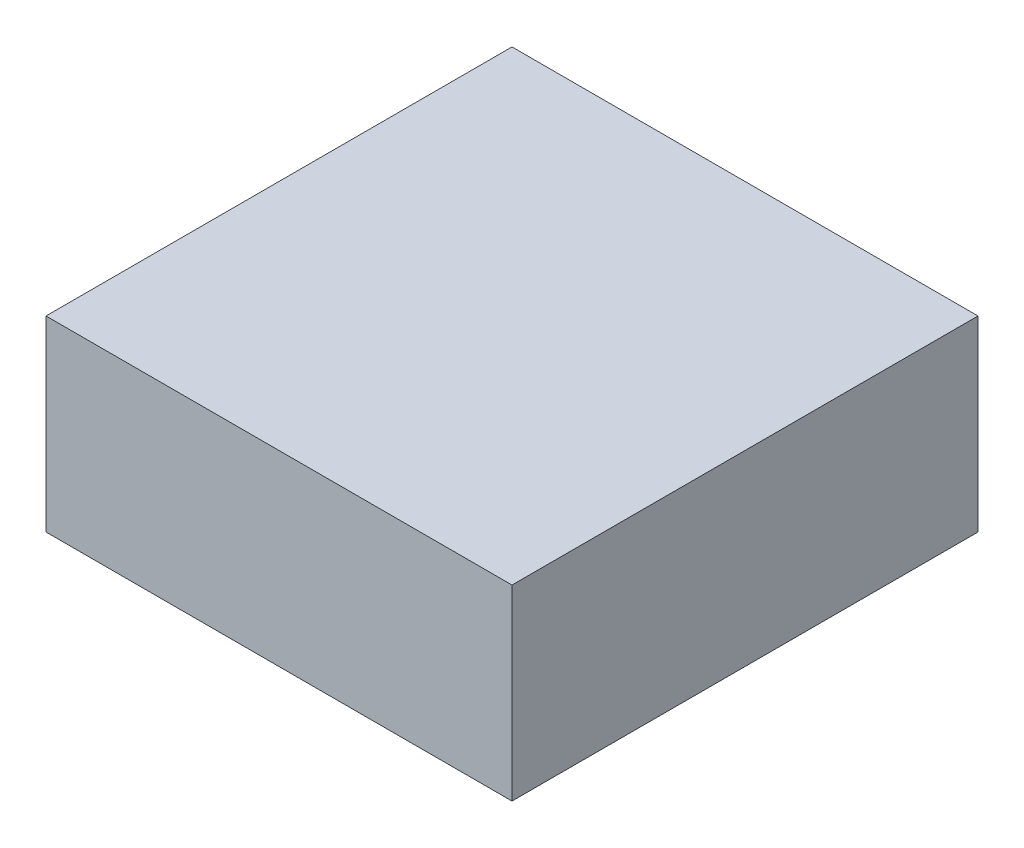
ISO-10303-21;
HEADER;
FILE_DESCRIPTION(('STEP AP214'),'2;1');
FILE_NAME('part.step','',(''),(''),'','','');
FILE_SCHEMA(('AUTOMOTIVE_DESIGN { 1 0 10303 214 1 1 1 1 }'));
ENDSEC;
DATA;
#1=APPLICATION_CONTEXT('core data for automotive mechanical design processes');
#2=APPLICATION_PROTOCOL_DEFINITION('international standard','automotive_design',2000,#1);
#3=PRODUCT_CONTEXT('',#1,'mechanical');
#4=PRODUCT('Part','Part','',(#3));
#5=PRODUCT_RELATED_PRODUCT_CATEGORY('part','',(#4));
#6=PRODUCT_DEFINITION_FORMATION('','',#4);
#7=PRODUCT_DEFINITION_CONTEXT('part definition',#1,'design');
#8=PRODUCT_DEFINITION('design','',#6,#7);
#9=PRODUCT_DEFINITION_SHAPE('','',#8);
#10=(LENGTH_UNIT() NAMED_UNIT(*) SI_UNIT(.MILLI.,.METRE.));
#11=(NAMED_UNIT(*) PLANE_ANGLE_UNIT() SI_UNIT($,.RADIAN.));
#12=(NAMED_UNIT(*) SI_UNIT($,.STERADIAN.) SOLID_ANGLE_UNIT());
#13=UNCERTAINTY_MEASURE_WITH_UNIT(LENGTH_MEASURE(1.E-05),#10,'distance_accuracy_value','');
#14=(GEOMETRIC_REPRESENTATION_CONTEXT(3) GLOBAL_UNCERTAINTY_ASSIGNED_CONTEXT((#13)) GLOBAL_UNIT_ASSIGNED_CONTEXT((#10,
#11,#12)) REPRESENTATION_CONTEXT('',''));
#15=CARTESIAN_POINT('',(0.,0.,0.));
#16=DIRECTION('',(0.,0.,1.));
#17=DIRECTION('',(1.,0.,0.));
#18=AXIS2_PLACEMENT_3D('',#15,#16,#17);
#19=CARTESIAN_POINT('',(3.91,-3.14,-3.91));
#20=DIRECTION('',(1.,0.,0.));
#21=DIRECTION('',(0.,0.,-1.));
#22=AXIS2_PLACEMENT_3D('',#19,#20,#21);
#23=PLANE('',#22);
#24=DIRECTION('',(0.,0.,-1.));
#25=VECTOR('',#24,1.);
#26=CARTESIAN_POINT('',(3.91,0.,-3.91));
#27=LINE('',#26,#25);
#28=CARTESIAN_POINT('',(3.91,0.,3.91));
#29=VERTEX_POINT('',#28);
#30=CARTESIAN_POINT('',(3.91,0.,-3.91));
#31=VERTEX_POINT('',#30);
#32=EDGE_CURVE('E114',#29,#31,#27,.T.);
#33=ORIENTED_EDGE('',*,*,#32,.F.);
#34=DIRECTION('',(0.,1.,0.));
#35=VECTOR('',#34,1.);
#36=CARTESIAN_POINT('',(3.91,-3.14,3.91));
#37=LINE('',#36,#35);
#38=CARTESIAN_POINT('',(3.91,-3.14,3.91));
#39=VERTEX_POINT('',#38);
#40=EDGE_CURVE('E11',#39,#29,#37,.T.);
#41=ORIENTED_EDGE('',*,*,#40,.F.);
#42=DIRECTION('',(0.,0.,-1.));
#43=VECTOR('',#42,1.);
#44=CARTESIAN_POINT('',(3.91,-3.14,-3.91));
#45=LINE('',#44,#43);
#46=CARTESIAN_POINT('',(3.91,-3.14,-3.91));
#47=VERTEX_POINT('',#46);
#48=EDGE_CURVE('E145',#39,#47,#45,.T.);
#49=ORIENTED_EDGE('',*,*,#48,.T.);
#50=DIRECTION('',(0.,1.,0.));
#51=VECTOR('',#50,1.);
#52=CARTESIAN_POINT('',(3.91,-3.14,-3.91));
#53=LINE('',#52,#51);
#54=EDGE_CURVE('E35',#47,#31,#53,.T.);
#55=ORIENTED_EDGE('',*,*,#54,.T.);
#56=EDGE_LOOP('',(#33,#41,#49,#55));
#57=FACE_BOUND('',#56,.T.);
#58=ADVANCED_FACE('F32',(#57),#23,.T.);
#59=CARTESIAN_POINT('',(-3.91,-3.14,3.91));
#60=DIRECTION('',(0.,0.,1.));
#61=DIRECTION('',(1.,0.,0.));
#62=AXIS2_PLACEMENT_3D('',#59,#60,#61);
#63=PLANE('',#62);
#64=DIRECTION('',(1.,0.,0.));
#65=VECTOR('',#64,1.);
#66=CARTESIAN_POINT('',(-3.91,0.,3.91));
#67=LINE('',#66,#65);
#68=CARTESIAN_POINT('',(-3.91,0.,3.91));
#69=VERTEX_POINT('',#68);
#70=EDGE_CURVE('E148',#69,#29,#67,.T.);
#71=ORIENTED_EDGE('',*,*,#70,.F.);
#72=DIRECTION('',(0.,1.,0.));
#73=VECTOR('',#72,1.);
#74=CARTESIAN_POINT('',(-3.91,-3.14,3.91));
#75=LINE('',#74,#73);
#76=CARTESIAN_POINT('',(-3.91,-3.14,3.91));
#77=VERTEX_POINT('',#76);
#78=EDGE_CURVE('E40',#77,#69,#75,.T.);
#79=ORIENTED_EDGE('',*,*,#78,.F.);
#80=DIRECTION('',(1.,0.,0.));
#81=VECTOR('',#80,1.);
#82=CARTESIAN_POINT('',(-3.91,-3.14,3.91));
#83=LINE('',#82,#81);
#84=EDGE_CURVE('E153',#77,#39,#83,.T.);
#85=ORIENTED_EDGE('',*,*,#84,.T.);
#86=ORIENTED_EDGE('',*,*,#40,.T.);
#87=EDGE_LOOP('',(#71,#79,#85,#86));
#88=FACE_BOUND('',#87,.T.);
#89=ADVANCED_FACE('F170',(#88),#63,.T.);
#90=CARTESIAN_POINT('',(-3.91,-3.14,-3.91));
#91=DIRECTION('',(-1.,0.,0.));
#92=DIRECTION('',(0.,0.,1.));
#93=AXIS2_PLACEMENT_3D('',#90,#91,#92);
#94=PLANE('',#93);
#95=DIRECTION('',(0.,0.,1.));
#96=VECTOR('',#95,1.);
#97=CARTESIAN_POINT('',(-3.91,0.,-3.91));
#98=LINE('',#97,#96);
#99=CARTESIAN_POINT('',(-3.91,0.,-3.91));
#100=VERTEX_POINT('',#99);
#101=EDGE_CURVE('E160',#100,#69,#98,.T.);
#102=ORIENTED_EDGE('',*,*,#101,.F.);
#103=DIRECTION('',(0.,1.,0.));
#104=VECTOR('',#103,1.);
#105=CARTESIAN_POINT('',(-3.91,-3.14,-3.91));
#106=LINE('',#105,#104);
#107=CARTESIAN_POINT('',(-3.91,-3.14,-3.91));
#108=VERTEX_POINT('',#107);
#109=EDGE_CURVE('E165',#108,#100,#106,.T.);
#110=ORIENTED_EDGE('',*,*,#109,.F.);
#111=DIRECTION('',(0.,0.,1.));
#112=VECTOR('',#111,1.);
#113=CARTESIAN_POINT('',(-3.91,-3.14,-3.91));
#114=LINE('',#113,#112);
#115=EDGE_CURVE('E150',#108,#77,#114,.T.);
#116=ORIENTED_EDGE('',*,*,#115,.T.);
#117=ORIENTED_EDGE('',*,*,#78,.T.);
#118=EDGE_LOOP('',(#102,#110,#116,#117));
#119=FACE_BOUND('',#118,.T.);
#120=ADVANCED_FACE('F174',(#119),#94,.T.);
#121=CARTESIAN_POINT('',(-3.91,-3.14,-3.91));
#122=DIRECTION('',(0.,0.,-1.));
#123=DIRECTION('',(-1.,0.,0.));
#124=AXIS2_PLACEMENT_3D('',#121,#122,#123);
#125=PLANE('',#124);
#126=DIRECTION('',(-1.,0.,0.));
#127=VECTOR('',#126,1.);
#128=CARTESIAN_POINT('',(-3.91,0.,-3.91));
#129=LINE('',#128,#127);
#130=EDGE_CURVE('E157',#31,#100,#129,.T.);
#131=ORIENTED_EDGE('',*,*,#130,.F.);
#132=ORIENTED_EDGE('',*,*,#54,.F.);
#133=DIRECTION('',(-1.,0.,0.));
#134=VECTOR('',#133,1.);
#135=CARTESIAN_POINT('',(-3.91,-3.14,-3.91));
#136=LINE('',#135,#134);
#137=EDGE_CURVE('E147',#47,#108,#136,.T.);
#138=ORIENTED_EDGE('',*,*,#137,.T.);
#139=ORIENTED_EDGE('',*,*,#109,.T.);
#140=EDGE_LOOP('',(#131,#132,#138,#139));
#141=FACE_BOUND('',#140,.T.);
#142=ADVANCED_FACE('F167',(#141),#125,.T.);
#143=CARTESIAN_POINT('',(0.,-3.14,0.));
#144=DIRECTION('',(0.,1.,0.));
#145=DIRECTION('',(0.,0.,1.));
#146=AXIS2_PLACEMENT_3D('',#143,#144,#145);
#147=PLANE('',#146);
#148=DIRECTION('',(1.,0.,0.));
#149=VECTOR('',#148,1.);
#150=CARTESIAN_POINT('',(0.,-3.14,2.41));
#151=LINE('',#150,#149);
#152=CARTESIAN_POINT('',(-2.41,-3.14,2.41));
#153=VERTEX_POINT('',#152);
#154=CARTESIAN_POINT('',(2.41,-3.14,2.41));
#155=VERTEX_POINT('',#154);
#156=EDGE_CURVE('E140',#153,#155,#151,.T.);
#157=ORIENTED_EDGE('',*,*,#156,.T.);
#158=DIRECTION('',(0.,0.,-1.));
#159=VECTOR('',#158,1.);
#160=CARTESIAN_POINT('',(2.41,-3.14,0.));
#161=LINE('',#160,#159);
#162=CARTESIAN_POINT('',(2.41,-3.14,-2.41));
#163=VERTEX_POINT('',#162);
#164=EDGE_CURVE('E109',#155,#163,#161,.T.);
#165=ORIENTED_EDGE('',*,*,#164,.T.);
#166=DIRECTION('',(-1.,0.,0.));
#167=VECTOR('',#166,1.);
#168=CARTESIAN_POINT('',(0.,-3.14,-2.41));
#169=LINE('',#168,#167);
#170=CARTESIAN_POINT('',(-2.41,-3.14,-2.41));
#171=VERTEX_POINT('',#170);
#172=EDGE_CURVE('E130',#163,#171,#169,.T.);
#173=ORIENTED_EDGE('',*,*,#172,.T.);
#174=DIRECTION('',(0.,0.,1.));
#175=VECTOR('',#174,1.);
#176=CARTESIAN_POINT('',(-2.41,-3.14,0.));
#177=LINE('',#176,#175);
#178=EDGE_CURVE('E48',#171,#153,#177,.T.);
#179=ORIENTED_EDGE('',*,*,#178,.T.);
#180=EDGE_LOOP('',(#157,#165,#173,#179));
#181=FACE_BOUND('',#180,.T.);
#182=ORIENTED_EDGE('',*,*,#48,.F.);
#183=ORIENTED_EDGE('',*,*,#84,.F.);
#184=ORIENTED_EDGE('',*,*,#115,.F.);
#185=ORIENTED_EDGE('',*,*,#137,.F.);
#186=EDGE_LOOP('',(#182,#183,#184,#185));
#187=FACE_BOUND('',#186,.T.);
#188=ADVANCED_FACE('F176',(#181,#187),#147,.F.);
#189=CARTESIAN_POINT('',(0.,0.,0.));
#190=DIRECTION('',(0.,1.,0.));
#191=DIRECTION('',(0.,0.,1.));
#192=AXIS2_PLACEMENT_3D('',#189,#190,#191);
#193=PLANE('',#192);
#194=ORIENTED_EDGE('',*,*,#32,.T.);
#195=ORIENTED_EDGE('',*,*,#130,.T.);
#196=ORIENTED_EDGE('',*,*,#101,.T.);
#197=ORIENTED_EDGE('',*,*,#70,.T.);
#198=EDGE_LOOP('',(#194,#195,#196,#197));
#199=FACE_BOUND('',#198,.T.);
#200=ADVANCED_FACE('F169',(#199),#193,.T.);
#201=CARTESIAN_POINT('',(2.41,-3.14,-3.91));
#202=DIRECTION('',(1.,0.,0.));
#203=DIRECTION('',(0.,0.,-1.));
#204=AXIS2_PLACEMENT_3D('',#201,#202,#203);
#205=PLANE('',#204);
#206=DIRECTION('',(0.,0.,-1.));
#207=VECTOR('',#206,1.);
#208=CARTESIAN_POINT('',(2.41,-1.5,0.));
#209=LINE('',#208,#207);
#210=CARTESIAN_POINT('',(2.41,-1.5,2.41));
#211=VERTEX_POINT('',#210);
#212=CARTESIAN_POINT('',(2.41,-1.5,-2.41));
#213=VERTEX_POINT('',#212);
#214=EDGE_CURVE('E107',#211,#213,#209,.T.);
#215=ORIENTED_EDGE('',*,*,#214,.T.);
#216=DIRECTION('',(0.,1.,0.));
#217=VECTOR('',#216,1.);
#218=CARTESIAN_POINT('',(2.41,-3.14,-2.41));
#219=LINE('',#218,#217);
#220=EDGE_CURVE('E135',#163,#213,#219,.T.);
#221=ORIENTED_EDGE('',*,*,#220,.F.);
#222=ORIENTED_EDGE('',*,*,#164,.F.);
#223=DIRECTION('',(0.,1.,0.));
#224=VECTOR('',#223,1.);
#225=CARTESIAN_POINT('',(2.41,-3.14,2.41));
#226=LINE('',#225,#224);
#227=EDGE_CURVE('E104',#155,#211,#226,.T.);
#228=ORIENTED_EDGE('',*,*,#227,.T.);
#229=EDGE_LOOP('',(#215,#221,#222,#228));
#230=FACE_BOUND('',#229,.T.);
#231=ADVANCED_FACE('F106',(#230),#205,.F.);
#232=CARTESIAN_POINT('',(-3.91,-3.14,2.41));
#233=DIRECTION('',(0.,0.,1.));
#234=DIRECTION('',(1.,0.,0.));
#235=AXIS2_PLACEMENT_3D('',#232,#233,#234);
#236=PLANE('',#235);
#237=DIRECTION('',(1.,0.,0.));
#238=VECTOR('',#237,1.);
#239=CARTESIAN_POINT('',(0.,-1.5,2.41));
#240=LINE('',#239,#238);
#241=CARTESIAN_POINT('',(-2.41,-1.5,2.41));
#242=VERTEX_POINT('',#241);
#243=EDGE_CURVE('E122',#242,#211,#240,.T.);
#244=ORIENTED_EDGE('',*,*,#243,.T.);
#245=ORIENTED_EDGE('',*,*,#227,.F.);
#246=ORIENTED_EDGE('',*,*,#156,.F.);
#247=DIRECTION('',(0.,1.,0.));
#248=VECTOR('',#247,1.);
#249=CARTESIAN_POINT('',(-2.41,-3.14,2.41));
#250=LINE('',#249,#248);
#251=EDGE_CURVE('E115',#153,#242,#250,.T.);
#252=ORIENTED_EDGE('',*,*,#251,.T.);
#253=EDGE_LOOP('',(#244,#245,#246,#252));
#254=FACE_BOUND('',#253,.T.);
#255=ADVANCED_FACE('F126',(#254),#236,.F.);
#256=CARTESIAN_POINT('',(-2.41,-3.14,-3.91));
#257=DIRECTION('',(-1.,0.,0.));
#258=DIRECTION('',(0.,0.,1.));
#259=AXIS2_PLACEMENT_3D('',#256,#257,#258);
#260=PLANE('',#259);
#261=DIRECTION('',(0.,0.,1.));
#262=VECTOR('',#261,1.);
#263=CARTESIAN_POINT('',(-2.41,-1.5,0.));
#264=LINE('',#263,#262);
#265=CARTESIAN_POINT('',(-2.41,-1.5,-2.41));
#266=VERTEX_POINT('',#265);
#267=EDGE_CURVE('E128',#266,#242,#264,.T.);
#268=ORIENTED_EDGE('',*,*,#267,.T.);
#269=ORIENTED_EDGE('',*,*,#251,.F.);
#270=ORIENTED_EDGE('',*,*,#178,.F.);
#271=DIRECTION('',(0.,1.,0.));
#272=VECTOR('',#271,1.);
#273=CARTESIAN_POINT('',(-2.41,-3.14,-2.41));
#274=LINE('',#273,#272);
#275=EDGE_CURVE('E136',#171,#266,#274,.T.);
#276=ORIENTED_EDGE('',*,*,#275,.T.);
#277=EDGE_LOOP('',(#268,#269,#270,#276));
#278=FACE_BOUND('',#277,.T.);
#279=ADVANCED_FACE('F228',(#278),#260,.F.);
#280=CARTESIAN_POINT('',(-3.91,-3.14,-2.41));
#281=DIRECTION('',(0.,0.,-1.));
#282=DIRECTION('',(-1.,0.,0.));
#283=AXIS2_PLACEMENT_3D('',#280,#281,#282);
#284=PLANE('',#283);
#285=DIRECTION('',(-1.,0.,0.));
#286=VECTOR('',#285,1.);
#287=CARTESIAN_POINT('',(0.,-1.5,-2.41));
#288=LINE('',#287,#286);
#289=EDGE_CURVE('E124',#213,#266,#288,.T.);
#290=ORIENTED_EDGE('',*,*,#289,.T.);
#291=ORIENTED_EDGE('',*,*,#275,.F.);
#292=ORIENTED_EDGE('',*,*,#172,.F.);
#293=ORIENTED_EDGE('',*,*,#220,.T.);
#294=EDGE_LOOP('',(#290,#291,#292,#293));
#295=FACE_BOUND('',#294,.T.);
#296=ADVANCED_FACE('F237',(#295),#284,.F.);
#297=CARTESIAN_POINT('',(0.,-1.5,0.));
#298=DIRECTION('',(0.,1.,0.));
#299=DIRECTION('',(0.,0.,1.));
#300=AXIS2_PLACEMENT_3D('',#297,#298,#299);
#301=PLANE('',#300);
#302=ORIENTED_EDGE('',*,*,#214,.F.);
#303=ORIENTED_EDGE('',*,*,#243,.F.);
#304=ORIENTED_EDGE('',*,*,#267,.F.);
#305=ORIENTED_EDGE('',*,*,#289,.F.);
#306=EDGE_LOOP('',(#302,#303,#304,#305));
#307=FACE_BOUND('',#306,.T.);
#308=ADVANCED_FACE('F120',(#307),#301,.F.);
#309=CLOSED_SHELL('',(#58,#89,#120,#142,#188,#200,#231,#255,#279,#296,#308));
#310=MANIFOLD_SOLID_BREP('B2',#309);
#311=ADVANCED_BREP_SHAPE_REPRESENTATION('',(#18,#310),#14);
#312=SHAPE_DEFINITION_REPRESENTATION(#9,#311);
ENDSEC;
END-ISO-10303-21;
